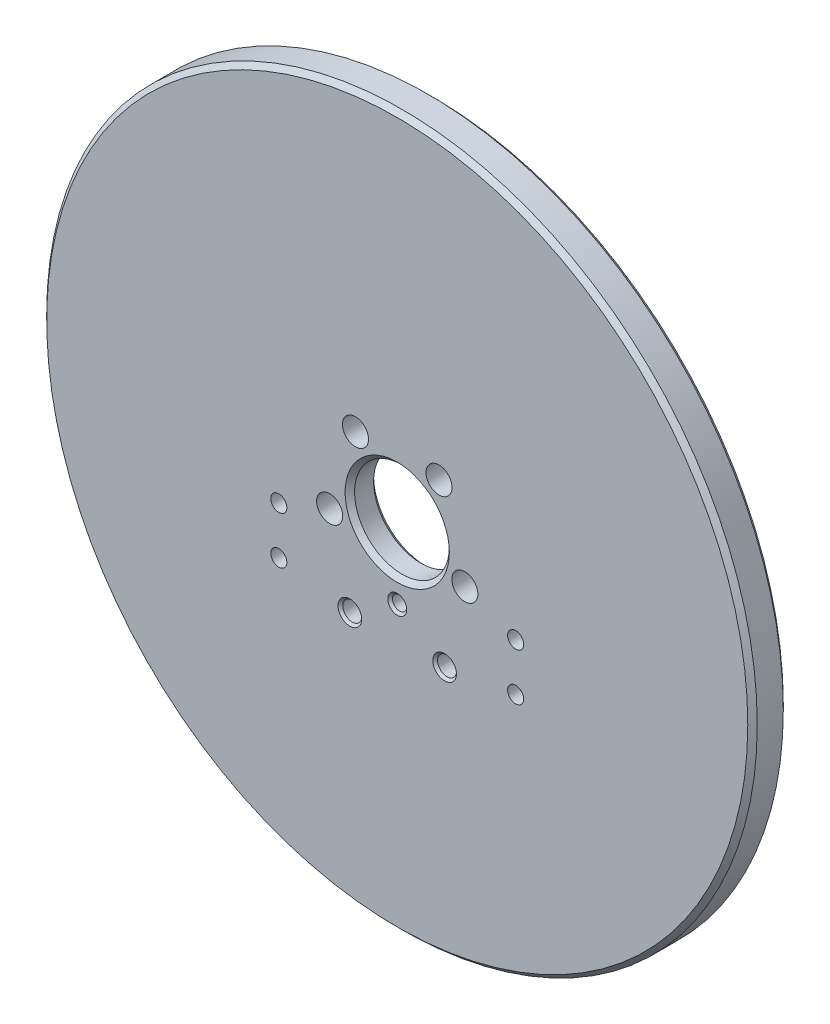
ISO-10303-21;
HEADER;
FILE_DESCRIPTION(('STEP AP214'),'2;1');
FILE_NAME('part.step','',(''),(''),'','','');
FILE_SCHEMA(('AUTOMOTIVE_DESIGN { 1 0 10303 214 1 1 1 1 }'));
ENDSEC;
DATA;
#1=APPLICATION_CONTEXT('core data for automotive mechanical design processes');
#2=APPLICATION_PROTOCOL_DEFINITION('international standard','automotive_design',2000,#1);
#3=PRODUCT_CONTEXT('',#1,'mechanical');
#4=PRODUCT('Part','Part','',(#3));
#5=PRODUCT_RELATED_PRODUCT_CATEGORY('part','',(#4));
#6=PRODUCT_DEFINITION_FORMATION('','',#4);
#7=PRODUCT_DEFINITION_CONTEXT('part definition',#1,'design');
#8=PRODUCT_DEFINITION('design','',#6,#7);
#9=PRODUCT_DEFINITION_SHAPE('','',#8);
#10=(LENGTH_UNIT() NAMED_UNIT(*) SI_UNIT(.MILLI.,.METRE.));
#11=(NAMED_UNIT(*) PLANE_ANGLE_UNIT() SI_UNIT($,.RADIAN.));
#12=(NAMED_UNIT(*) SI_UNIT($,.STERADIAN.) SOLID_ANGLE_UNIT());
#13=UNCERTAINTY_MEASURE_WITH_UNIT(LENGTH_MEASURE(1.E-05),#10,'distance_accuracy_value','');
#14=(GEOMETRIC_REPRESENTATION_CONTEXT(3) GLOBAL_UNCERTAINTY_ASSIGNED_CONTEXT((#13)) GLOBAL_UNIT_ASSIGNED_CONTEXT((#10,
#11,#12)) REPRESENTATION_CONTEXT('',''));
#15=CARTESIAN_POINT('',(0.,0.,0.));
#16=DIRECTION('',(0.,0.,1.));
#17=DIRECTION('',(1.,0.,0.));
#18=AXIS2_PLACEMENT_3D('',#15,#16,#17);
#19=CARTESIAN_POINT('',(18.5566127690193,-25.5225230893839,1.00000000000001));
#20=DIRECTION('',(0.,0.,1.));
#21=DIRECTION('',(1.,0.,0.));
#22=AXIS2_PLACEMENT_3D('',#19,#20,#21);
#23=PLANE('',#22);
#24=CARTESIAN_POINT('',(18.5566127690193,-25.5225230893839,1.00000000000001));
#25=DIRECTION('',(0.,0.,1.));
#26=DIRECTION('',(1.,0.,0.));
#27=AXIS2_PLACEMENT_3D('',#24,#25,#26);
#28=CIRCLE('',#27,41.);
#29=CARTESIAN_POINT('',(59.5566127690193,-25.5225230893839,1.00000000000001));
#30=VERTEX_POINT('',#29);
#31=EDGE_CURVE('E11',#30,#30,#28,.T.);
#32=ORIENTED_EDGE('',*,*,#31,.T.);
#33=EDGE_LOOP('',(#32));
#34=FACE_BOUND('',#33,.T.);
#35=CARTESIAN_POINT('',(18.5566127690193,-25.5225230893839,1.00000000000001));
#36=DIRECTION('',(0.,0.,1.));
#37=DIRECTION('',(1.,0.,0.));
#38=AXIS2_PLACEMENT_3D('',#35,#36,#37);
#39=CIRCLE('',#38,148.);
#40=CARTESIAN_POINT('',(166.556612769019,-25.5225230893839,1.00000000000001));
#41=VERTEX_POINT('',#40);
#42=EDGE_CURVE('E62',#41,#41,#39,.F.);
#43=ORIENTED_EDGE('',*,*,#42,.T.);
#44=EDGE_LOOP('',(#43));
#45=FACE_BOUND('',#44,.T.);
#46=CARTESIAN_POINT('',(-1.44338723098072,-68.5225230893839,1.00000000000001));
#47=DIRECTION('',(0.,0.,1.));
#48=DIRECTION('',(1.,0.,0.));
#49=AXIS2_PLACEMENT_3D('',#46,#47,#48);
#50=CIRCLE('',#49,4.00000000000001);
#51=CARTESIAN_POINT('',(2.55661276901929,-68.5225230893839,1.00000000000001));
#52=VERTEX_POINT('',#51);
#53=EDGE_CURVE('E149',#52,#52,#50,.T.);
#54=ORIENTED_EDGE('',*,*,#53,.T.);
#55=EDGE_LOOP('',(#54));
#56=FACE_BOUND('',#55,.T.);
#57=CARTESIAN_POINT('',(38.5566127690193,-68.5225230893839,1.00000000000001));
#58=DIRECTION('',(0.,0.,1.));
#59=DIRECTION('',(1.,0.,0.));
#60=AXIS2_PLACEMENT_3D('',#57,#58,#59);
#61=CIRCLE('',#60,4.00000000000003);
#62=CARTESIAN_POINT('',(42.5566127690193,-68.5225230893839,1.00000000000001));
#63=VERTEX_POINT('',#62);
#64=EDGE_CURVE('E152',#63,#63,#61,.T.);
#65=ORIENTED_EDGE('',*,*,#64,.T.);
#66=EDGE_LOOP('',(#65));
#67=FACE_BOUND('',#66,.T.);
#68=CARTESIAN_POINT('',(68.5566127690193,-63.5225230893839,1.00000000000001));
#69=DIRECTION('',(0.,0.,1.));
#70=DIRECTION('',(1.,0.,0.));
#71=AXIS2_PLACEMENT_3D('',#68,#69,#70);
#72=CIRCLE('',#71,3.4);
#73=CARTESIAN_POINT('',(71.9566127690193,-63.5225230893839,1.00000000000001));
#74=VERTEX_POINT('',#73);
#75=EDGE_CURVE('E155',#74,#74,#72,.T.);
#76=ORIENTED_EDGE('',*,*,#75,.T.);
#77=EDGE_LOOP('',(#76));
#78=FACE_BOUND('',#77,.T.);
#79=CARTESIAN_POINT('',(68.5566127690193,-43.5225230893839,1.00000000000001));
#80=DIRECTION('',(0.,0.,1.));
#81=DIRECTION('',(1.,0.,0.));
#82=AXIS2_PLACEMENT_3D('',#79,#80,#81);
#83=CIRCLE('',#82,3.4);
#84=CARTESIAN_POINT('',(71.9566127690193,-43.5225230893839,1.00000000000001));
#85=VERTEX_POINT('',#84);
#86=EDGE_CURVE('E161',#85,#85,#83,.T.);
#87=ORIENTED_EDGE('',*,*,#86,.T.);
#88=EDGE_LOOP('',(#87));
#89=FACE_BOUND('',#88,.T.);
#90=CARTESIAN_POINT('',(-31.4433872309807,-63.5225230893839,1.00000000000001));
#91=DIRECTION('',(0.,0.,1.));
#92=DIRECTION('',(1.,0.,0.));
#93=AXIS2_PLACEMENT_3D('',#90,#91,#92);
#94=CIRCLE('',#93,3.4);
#95=CARTESIAN_POINT('',(-28.0433872309807,-63.5225230893839,1.00000000000001));
#96=VERTEX_POINT('',#95);
#97=EDGE_CURVE('E167',#96,#96,#94,.T.);
#98=ORIENTED_EDGE('',*,*,#97,.T.);
#99=EDGE_LOOP('',(#98));
#100=FACE_BOUND('',#99,.T.);
#101=CARTESIAN_POINT('',(-31.4433872309807,-43.5225230893839,1.00000000000001));
#102=DIRECTION('',(0.,0.,1.));
#103=DIRECTION('',(1.,0.,0.));
#104=AXIS2_PLACEMENT_3D('',#101,#102,#103);
#105=CIRCLE('',#104,3.4);
#106=CARTESIAN_POINT('',(-28.0433872309807,-43.5225230893839,1.00000000000001));
#107=VERTEX_POINT('',#106);
#108=EDGE_CURVE('E173',#107,#107,#105,.T.);
#109=ORIENTED_EDGE('',*,*,#108,.T.);
#110=EDGE_LOOP('',(#109));
#111=FACE_BOUND('',#110,.T.);
#112=ADVANCED_FACE('F33',(#34,#45,#56,#67,#78,#89,#100,#111),#23,.F.);
#113=CARTESIAN_POINT('',(18.5566127690193,-25.5225230893839,4.00000000000001));
#114=DIRECTION('',(0.,0.,-1.));
#115=DIRECTION('',(-1.,0.,0.));
#116=AXIS2_PLACEMENT_3D('',#113,#114,#115);
#117=CYLINDRICAL_SURFACE('',#116,35.);
#118=CARTESIAN_POINT('',(18.5566127690193,-25.5225230893839,-3.49999999999996));
#119=DIRECTION('',(0.,0.,-1.));
#120=DIRECTION('',(-1.,0.,0.));
#121=AXIS2_PLACEMENT_3D('',#118,#119,#120);
#122=CIRCLE('',#121,35.);
#123=CARTESIAN_POINT('',(-16.4433872309807,-25.5225230893839,-3.49999999999996));
#124=VERTEX_POINT('',#123);
#125=EDGE_CURVE('E74',#124,#124,#122,.T.);
#126=ORIENTED_EDGE('',*,*,#125,.T.);
#127=EDGE_LOOP('',(#126));
#128=FACE_BOUND('',#127,.T.);
#129=CARTESIAN_POINT('',(18.5566127690193,-25.5225230893839,4.00000000000001));
#130=DIRECTION('',(0.,0.,-1.));
#131=DIRECTION('',(-1.,0.,0.));
#132=AXIS2_PLACEMENT_3D('',#129,#130,#131);
#133=CIRCLE('',#132,35.);
#134=CARTESIAN_POINT('',(-16.4433872309807,-25.5225230893839,4.00000000000001));
#135=VERTEX_POINT('',#134);
#136=EDGE_CURVE('E95',#135,#135,#133,.T.);
#137=ORIENTED_EDGE('',*,*,#136,.F.);
#138=EDGE_LOOP('',(#137));
#139=FACE_BOUND('',#138,.T.);
#140=ADVANCED_FACE('F201',(#128,#139),#117,.F.);
#141=CARTESIAN_POINT('',(18.5566127690193,-25.5225230893839,4.00000000000001));
#142=DIRECTION('',(0.,0.,-1.));
#143=DIRECTION('',(-1.,0.,0.));
#144=AXIS2_PLACEMENT_3D('',#141,#142,#143);
#145=PLANE('',#144);
#146=CARTESIAN_POINT('',(18.5566127690193,-25.5225230893839,4.00000000000001));
#147=DIRECTION('',(0.,0.,-1.));
#148=DIRECTION('',(-1.,0.,0.));
#149=AXIS2_PLACEMENT_3D('',#146,#147,#148);
#150=CIRCLE('',#149,22.0000000000001);
#151=CARTESIAN_POINT('',(-3.4433872309808,-25.5225230893839,4.00000000000001));
#152=VERTEX_POINT('',#151);
#153=EDGE_CURVE('E48',#152,#152,#150,.F.);
#154=ORIENTED_EDGE('',*,*,#153,.T.);
#155=EDGE_LOOP('',(#154));
#156=FACE_BOUND('',#155,.T.);
#157=CARTESIAN_POINT('',(18.5566127690193,-55.5225230893839,4.00000000000001));
#158=DIRECTION('',(0.,0.,-1.));
#159=DIRECTION('',(-1.,0.,0.));
#160=AXIS2_PLACEMENT_3D('',#157,#158,#159);
#161=CIRCLE('',#160,2.99999999999999);
#162=CARTESIAN_POINT('',(15.5566127690193,-55.5225230893839,4.00000000000001));
#163=VERTEX_POINT('',#162);
#164=EDGE_CURVE('E146',#163,#163,#161,.T.);
#165=ORIENTED_EDGE('',*,*,#164,.F.);
#166=EDGE_LOOP('',(#165));
#167=FACE_BOUND('',#166,.T.);
#168=CARTESIAN_POINT('',(0.923055200245035,-1.25201325813547,4.00000000000001));
#169=DIRECTION('',(0.,0.,-1.));
#170=DIRECTION('',(-1.,0.,0.));
#171=AXIS2_PLACEMENT_3D('',#168,#169,#170);
#172=CIRCLE('',#171,3.3);
#173=CARTESIAN_POINT('',(-2.37694479975496,-1.25201325813547,4.00000000000001));
#174=VERTEX_POINT('',#173);
#175=EDGE_CURVE('E96',#174,#174,#172,.T.);
#176=ORIENTED_EDGE('',*,*,#175,.F.);
#177=EDGE_LOOP('',(#176));
#178=FACE_BOUND('',#177,.T.);
#179=CARTESIAN_POINT('',(36.1901703377934,-1.2520132581354,4.00000000000001));
#180=DIRECTION('',(0.,0.,-1.));
#181=DIRECTION('',(-1.,0.,0.));
#182=AXIS2_PLACEMENT_3D('',#179,#180,#181);
#183=CIRCLE('',#182,3.3);
#184=CARTESIAN_POINT('',(32.8901703377934,-1.2520132581354,4.00000000000001));
#185=VERTEX_POINT('',#184);
#186=EDGE_CURVE('E101',#185,#185,#183,.T.);
#187=ORIENTED_EDGE('',*,*,#186,.F.);
#188=EDGE_LOOP('',(#187));
#189=FACE_BOUND('',#188,.T.);
#190=CARTESIAN_POINT('',(47.0883082578739,-34.7930329206322,4.00000000000001));
#191=DIRECTION('',(0.,0.,-1.));
#192=DIRECTION('',(-1.,0.,0.));
#193=AXIS2_PLACEMENT_3D('',#190,#191,#192);
#194=CIRCLE('',#193,3.29999999999999);
#195=CARTESIAN_POINT('',(43.7883082578739,-34.7930329206322,4.00000000000001));
#196=VERTEX_POINT('',#195);
#197=EDGE_CURVE('E106',#196,#196,#194,.T.);
#198=ORIENTED_EDGE('',*,*,#197,.F.);
#199=EDGE_LOOP('',(#198));
#200=FACE_BOUND('',#199,.T.);
#201=CARTESIAN_POINT('',(-9.97508271983532,-34.7930329206323,4.00000000000001));
#202=DIRECTION('',(0.,0.,-1.));
#203=DIRECTION('',(-1.,0.,0.));
#204=AXIS2_PLACEMENT_3D('',#201,#202,#203);
#205=CIRCLE('',#204,3.3);
#206=CARTESIAN_POINT('',(-13.2750827198353,-34.7930329206323,4.00000000000001));
#207=VERTEX_POINT('',#206);
#208=EDGE_CURVE('E111',#207,#207,#205,.T.);
#209=ORIENTED_EDGE('',*,*,#208,.F.);
#210=EDGE_LOOP('',(#209));
#211=FACE_BOUND('',#210,.T.);
#212=ORIENTED_EDGE('',*,*,#136,.T.);
#213=EDGE_LOOP('',(#212));
#214=FACE_BOUND('',#213,.T.);
#215=ADVANCED_FACE('F206',(#156,#167,#178,#189,#200,#211,#214),#145,.T.);
#216=CARTESIAN_POINT('',(18.5566127690193,-25.5225230893839,16.));
#217=DIRECTION('',(0.,0.,1.));
#218=DIRECTION('',(1.,0.,0.));
#219=AXIS2_PLACEMENT_3D('',#216,#217,#218);
#220=PLANE('',#219);
#221=CARTESIAN_POINT('',(18.5566127690193,-25.5225230893839,16.));
#222=DIRECTION('',(0.,0.,1.));
#223=DIRECTION('',(1.,0.,0.));
#224=AXIS2_PLACEMENT_3D('',#221,#222,#223);
#225=CIRCLE('',#224,22.);
#226=CARTESIAN_POINT('',(40.5566127690193,-25.5225230893839,16.));
#227=VERTEX_POINT('',#226);
#228=EDGE_CURVE('E44',#227,#227,#225,.F.);
#229=ORIENTED_EDGE('',*,*,#228,.T.);
#230=EDGE_LOOP('',(#229));
#231=FACE_BOUND('',#230,.T.);
#232=CARTESIAN_POINT('',(18.5566127690193,-25.5225230893839,16.));
#233=DIRECTION('',(0.,0.,1.));
#234=DIRECTION('',(1.,0.,0.));
#235=AXIS2_PLACEMENT_3D('',#232,#233,#234);
#236=CIRCLE('',#235,148.);
#237=CARTESIAN_POINT('',(166.556612769019,-25.5225230893839,16.));
#238=VERTEX_POINT('',#237);
#239=EDGE_CURVE('E59',#238,#238,#236,.T.);
#240=ORIENTED_EDGE('',*,*,#239,.T.);
#241=EDGE_LOOP('',(#240));
#242=FACE_BOUND('',#241,.T.);
#243=CARTESIAN_POINT('',(-31.4433872309807,-43.5225230893839,16.));
#244=DIRECTION('',(0.,0.,1.));
#245=DIRECTION('',(1.,0.,0.));
#246=AXIS2_PLACEMENT_3D('',#243,#244,#245);
#247=CIRCLE('',#246,3.39999999999999);
#248=CARTESIAN_POINT('',(-28.0433872309807,-43.5225230893839,16.));
#249=VERTEX_POINT('',#248);
#250=EDGE_CURVE('E176',#249,#249,#247,.T.);
#251=ORIENTED_EDGE('',*,*,#250,.F.);
#252=EDGE_LOOP('',(#251));
#253=FACE_BOUND('',#252,.T.);
#254=CARTESIAN_POINT('',(-31.4433872309807,-63.5225230893839,16.));
#255=DIRECTION('',(0.,0.,1.));
#256=DIRECTION('',(1.,0.,0.));
#257=AXIS2_PLACEMENT_3D('',#254,#255,#256);
#258=CIRCLE('',#257,3.39999999999999);
#259=CARTESIAN_POINT('',(-28.0433872309807,-63.5225230893839,16.));
#260=VERTEX_POINT('',#259);
#261=EDGE_CURVE('E170',#260,#260,#258,.T.);
#262=ORIENTED_EDGE('',*,*,#261,.F.);
#263=EDGE_LOOP('',(#262));
#264=FACE_BOUND('',#263,.T.);
#265=CARTESIAN_POINT('',(68.5566127690193,-43.5225230893839,16.));
#266=DIRECTION('',(0.,0.,1.));
#267=DIRECTION('',(1.,0.,0.));
#268=AXIS2_PLACEMENT_3D('',#265,#266,#267);
#269=CIRCLE('',#268,3.39999999999999);
#270=CARTESIAN_POINT('',(71.9566127690193,-43.5225230893839,16.));
#271=VERTEX_POINT('',#270);
#272=EDGE_CURVE('E164',#271,#271,#269,.T.);
#273=ORIENTED_EDGE('',*,*,#272,.F.);
#274=EDGE_LOOP('',(#273));
#275=FACE_BOUND('',#274,.T.);
#276=CARTESIAN_POINT('',(68.5566127690193,-63.5225230893839,16.));
#277=DIRECTION('',(0.,0.,1.));
#278=DIRECTION('',(1.,0.,0.));
#279=AXIS2_PLACEMENT_3D('',#276,#277,#278);
#280=CIRCLE('',#279,3.39999999999999);
#281=CARTESIAN_POINT('',(71.9566127690193,-63.5225230893839,16.));
#282=VERTEX_POINT('',#281);
#283=EDGE_CURVE('E158',#282,#282,#280,.T.);
#284=ORIENTED_EDGE('',*,*,#283,.F.);
#285=EDGE_LOOP('',(#284));
#286=FACE_BOUND('',#285,.T.);
#287=CARTESIAN_POINT('',(38.5566127690193,-68.5225230893839,16.));
#288=DIRECTION('',(0.,0.,1.));
#289=DIRECTION('',(1.,0.,0.));
#290=AXIS2_PLACEMENT_3D('',#287,#288,#289);
#291=CIRCLE('',#290,5.00000000000012);
#292=CARTESIAN_POINT('',(43.5566127690194,-68.5225230893839,16.));
#293=VERTEX_POINT('',#292);
#294=EDGE_CURVE('E80',#293,#293,#291,.F.);
#295=ORIENTED_EDGE('',*,*,#294,.T.);
#296=EDGE_LOOP('',(#295));
#297=FACE_BOUND('',#296,.T.);
#298=CARTESIAN_POINT('',(-1.44338723098072,-68.5225230893839,16.));
#299=DIRECTION('',(0.,0.,1.));
#300=DIRECTION('',(1.,0.,0.));
#301=AXIS2_PLACEMENT_3D('',#298,#299,#300);
#302=CIRCLE('',#301,5.00000000000011);
#303=CARTESIAN_POINT('',(3.5566127690194,-68.5225230893839,16.));
#304=VERTEX_POINT('',#303);
#305=EDGE_CURVE('E83',#304,#304,#302,.F.);
#306=ORIENTED_EDGE('',*,*,#305,.T.);
#307=EDGE_LOOP('',(#306));
#308=FACE_BOUND('',#307,.T.);
#309=CARTESIAN_POINT('',(18.5566127690193,-55.5225230893839,16.));
#310=DIRECTION('',(0.,0.,1.));
#311=DIRECTION('',(1.,0.,0.));
#312=AXIS2_PLACEMENT_3D('',#309,#310,#311);
#313=CIRCLE('',#312,3.99999999999984);
#314=CARTESIAN_POINT('',(22.5566127690191,-55.5225230893839,16.));
#315=VERTEX_POINT('',#314);
#316=EDGE_CURVE('E89',#315,#315,#313,.F.);
#317=ORIENTED_EDGE('',*,*,#316,.T.);
#318=EDGE_LOOP('',(#317));
#319=FACE_BOUND('',#318,.T.);
#320=CARTESIAN_POINT('',(0.923055200245035,-1.25201325813547,16.));
#321=DIRECTION('',(0.,0.,1.));
#322=DIRECTION('',(1.,0.,0.));
#323=AXIS2_PLACEMENT_3D('',#320,#321,#322);
#324=CIRCLE('',#323,5.5);
#325=CARTESIAN_POINT('',(6.42305520024503,-1.25201325813547,16.));
#326=VERTEX_POINT('',#325);
#327=EDGE_CURVE('E143',#326,#326,#324,.T.);
#328=ORIENTED_EDGE('',*,*,#327,.F.);
#329=EDGE_LOOP('',(#328));
#330=FACE_BOUND('',#329,.T.);
#331=CARTESIAN_POINT('',(36.1901703377934,-1.2520132581354,16.));
#332=DIRECTION('',(0.,0.,1.));
#333=DIRECTION('',(1.,0.,0.));
#334=AXIS2_PLACEMENT_3D('',#331,#332,#333);
#335=CIRCLE('',#334,5.5);
#336=CARTESIAN_POINT('',(41.6901703377934,-1.2520132581354,16.));
#337=VERTEX_POINT('',#336);
#338=EDGE_CURVE('E99',#337,#337,#335,.T.);
#339=ORIENTED_EDGE('',*,*,#338,.F.);
#340=EDGE_LOOP('',(#339));
#341=FACE_BOUND('',#340,.T.);
#342=CARTESIAN_POINT('',(47.0883082578739,-34.7930329206322,16.));
#343=DIRECTION('',(0.,0.,1.));
#344=DIRECTION('',(1.,0.,0.));
#345=AXIS2_PLACEMENT_3D('',#342,#343,#344);
#346=CIRCLE('',#345,5.5);
#347=CARTESIAN_POINT('',(52.5883082578739,-34.7930329206322,16.));
#348=VERTEX_POINT('',#347);
#349=EDGE_CURVE('E104',#348,#348,#346,.T.);
#350=ORIENTED_EDGE('',*,*,#349,.F.);
#351=EDGE_LOOP('',(#350));
#352=FACE_BOUND('',#351,.T.);
#353=CARTESIAN_POINT('',(-9.97508271983532,-34.7930329206323,16.));
#354=DIRECTION('',(0.,0.,1.));
#355=DIRECTION('',(1.,0.,0.));
#356=AXIS2_PLACEMENT_3D('',#353,#354,#355);
#357=CIRCLE('',#356,5.5);
#358=CARTESIAN_POINT('',(-4.47508271983532,-34.7930329206323,16.));
#359=VERTEX_POINT('',#358);
#360=EDGE_CURVE('E109',#359,#359,#357,.T.);
#361=ORIENTED_EDGE('',*,*,#360,.F.);
#362=EDGE_LOOP('',(#361));
#363=FACE_BOUND('',#362,.T.);
#364=ADVANCED_FACE('F212',(#231,#242,#253,#264,#275,#286,#297,#308,#319,#330,#341,#352,#363),
#220,.T.);
#365=CARTESIAN_POINT('',(18.5566127690193,-25.5225230893839,16.));
#366=DIRECTION('',(0.,0.,-1.));
#367=DIRECTION('',(-1.,0.,0.));
#368=AXIS2_PLACEMENT_3D('',#365,#366,#367);
#369=CYLINDRICAL_SURFACE('',#368,150.);
#370=CARTESIAN_POINT('',(18.5566127690193,-25.5225230893839,3.0000000000001));
#371=DIRECTION('',(0.,0.,1.));
#372=DIRECTION('',(1.,0.,0.));
#373=AXIS2_PLACEMENT_3D('',#370,#371,#372);
#374=CIRCLE('',#373,150.);
#375=CARTESIAN_POINT('',(168.556612769019,-25.5225230893839,3.0000000000001));
#376=VERTEX_POINT('',#375);
#377=EDGE_CURVE('E65',#376,#376,#374,.T.);
#378=ORIENTED_EDGE('',*,*,#377,.T.);
#379=EDGE_LOOP('',(#378));
#380=FACE_BOUND('',#379,.T.);
#381=CARTESIAN_POINT('',(18.5566127690193,-25.5225230893839,14.));
#382=DIRECTION('',(0.,0.,1.));
#383=DIRECTION('',(1.,0.,0.));
#384=AXIS2_PLACEMENT_3D('',#381,#382,#383);
#385=CIRCLE('',#384,150.);
#386=CARTESIAN_POINT('',(168.556612769019,-25.5225230893839,14.));
#387=VERTEX_POINT('',#386);
#388=EDGE_CURVE('E68',#387,#387,#385,.F.);
#389=ORIENTED_EDGE('',*,*,#388,.T.);
#390=EDGE_LOOP('',(#389));
#391=FACE_BOUND('',#390,.T.);
#392=ADVANCED_FACE('F213',(#380,#391),#369,.T.);
#393=CARTESIAN_POINT('',(-9.97508271983532,-34.7930329206323,16.));
#394=DIRECTION('',(0.,0.,1.));
#395=DIRECTION('',(1.,0.,0.));
#396=AXIS2_PLACEMENT_3D('',#393,#394,#395);
#397=CYLINDRICAL_SURFACE('',#396,3.3);
#398=ORIENTED_EDGE('',*,*,#208,.T.);
#399=EDGE_LOOP('',(#398));
#400=FACE_BOUND('',#399,.T.);
#401=CARTESIAN_POINT('',(-9.97508271983532,-34.7930329206323,8.00000000000001));
#402=DIRECTION('',(0.,0.,1.));
#403=DIRECTION('',(1.,0.,0.));
#404=AXIS2_PLACEMENT_3D('',#401,#402,#403);
#405=CIRCLE('',#404,3.3);
#406=CARTESIAN_POINT('',(-6.67508271983532,-34.7930329206323,8.00000000000001));
#407=VERTEX_POINT('',#406);
#408=EDGE_CURVE('E114',#407,#407,#405,.T.);
#409=ORIENTED_EDGE('',*,*,#408,.T.);
#410=EDGE_LOOP('',(#409));
#411=FACE_BOUND('',#410,.T.);
#412=ADVANCED_FACE('F216',(#400,#411),#397,.F.);
#413=CARTESIAN_POINT('',(-6.67508271983532,-34.7930329206323,8.00000000000001));
#414=DIRECTION('',(0.,0.,-1.));
#415=DIRECTION('',(-1.,0.,0.));
#416=AXIS2_PLACEMENT_3D('',#413,#414,#415);
#417=PLANE('',#416);
#418=ORIENTED_EDGE('',*,*,#408,.F.);
#419=EDGE_LOOP('',(#418));
#420=FACE_BOUND('',#419,.T.);
#421=CARTESIAN_POINT('',(-9.97508271983532,-34.7930329206323,8.00000000000001));
#422=DIRECTION('',(0.,0.,1.));
#423=DIRECTION('',(1.,0.,0.));
#424=AXIS2_PLACEMENT_3D('',#421,#422,#423);
#425=CIRCLE('',#424,5.5);
#426=CARTESIAN_POINT('',(-4.47508271983532,-34.7930329206323,8.00000000000001));
#427=VERTEX_POINT('',#426);
#428=EDGE_CURVE('E119',#427,#427,#425,.T.);
#429=ORIENTED_EDGE('',*,*,#428,.T.);
#430=EDGE_LOOP('',(#429));
#431=FACE_BOUND('',#430,.T.);
#432=ADVANCED_FACE('F339',(#420,#431),#417,.F.);
#433=CARTESIAN_POINT('',(-9.97508271983532,-34.7930329206323,16.));
#434=DIRECTION('',(0.,0.,1.));
#435=DIRECTION('',(1.,0.,0.));
#436=AXIS2_PLACEMENT_3D('',#433,#434,#435);
#437=CYLINDRICAL_SURFACE('',#436,5.5);
#438=ORIENTED_EDGE('',*,*,#428,.F.);
#439=EDGE_LOOP('',(#438));
#440=FACE_BOUND('',#439,.T.);
#441=ORIENTED_EDGE('',*,*,#360,.T.);
#442=EDGE_LOOP('',(#441));
#443=FACE_BOUND('',#442,.T.);
#444=ADVANCED_FACE('F346',(#440,#443),#437,.F.);
#445=CARTESIAN_POINT('',(47.0883082578739,-34.7930329206322,16.));
#446=DIRECTION('',(0.,0.,1.));
#447=DIRECTION('',(1.,0.,0.));
#448=AXIS2_PLACEMENT_3D('',#445,#446,#447);
#449=CYLINDRICAL_SURFACE('',#448,3.29999999999999);
#450=ORIENTED_EDGE('',*,*,#197,.T.);
#451=EDGE_LOOP('',(#450));
#452=FACE_BOUND('',#451,.T.);
#453=CARTESIAN_POINT('',(47.0883082578739,-34.7930329206322,8.00000000000001));
#454=DIRECTION('',(0.,0.,1.));
#455=DIRECTION('',(1.,0.,0.));
#456=AXIS2_PLACEMENT_3D('',#453,#454,#455);
#457=CIRCLE('',#456,3.3);
#458=CARTESIAN_POINT('',(50.3883082578739,-34.7930329206322,8.00000000000001));
#459=VERTEX_POINT('',#458);
#460=EDGE_CURVE('E110',#459,#459,#457,.T.);
#461=ORIENTED_EDGE('',*,*,#460,.T.);
#462=EDGE_LOOP('',(#461));
#463=FACE_BOUND('',#462,.T.);
#464=ADVANCED_FACE('F354',(#452,#463),#449,.F.);
#465=CARTESIAN_POINT('',(50.3883082578739,-34.7930329206322,8.00000000000001));
#466=DIRECTION('',(0.,0.,-1.));
#467=DIRECTION('',(-1.,0.,0.));
#468=AXIS2_PLACEMENT_3D('',#465,#466,#467);
#469=PLANE('',#468);
#470=ORIENTED_EDGE('',*,*,#460,.F.);
#471=EDGE_LOOP('',(#470));
#472=FACE_BOUND('',#471,.T.);
#473=CARTESIAN_POINT('',(47.0883082578739,-34.7930329206322,8.00000000000001));
#474=DIRECTION('',(0.,0.,1.));
#475=DIRECTION('',(1.,0.,0.));
#476=AXIS2_PLACEMENT_3D('',#473,#474,#475);
#477=CIRCLE('',#476,5.5);
#478=CARTESIAN_POINT('',(52.5883082578739,-34.7930329206322,8.00000000000001));
#479=VERTEX_POINT('',#478);
#480=EDGE_CURVE('E126',#479,#479,#477,.T.);
#481=ORIENTED_EDGE('',*,*,#480,.T.);
#482=EDGE_LOOP('',(#481));
#483=FACE_BOUND('',#482,.T.);
#484=ADVANCED_FACE('F362',(#472,#483),#469,.F.);
#485=CARTESIAN_POINT('',(47.0883082578739,-34.7930329206322,16.));
#486=DIRECTION('',(0.,0.,1.));
#487=DIRECTION('',(1.,0.,0.));
#488=AXIS2_PLACEMENT_3D('',#485,#486,#487);
#489=CYLINDRICAL_SURFACE('',#488,5.5);
#490=ORIENTED_EDGE('',*,*,#480,.F.);
#491=EDGE_LOOP('',(#490));
#492=FACE_BOUND('',#491,.T.);
#493=ORIENTED_EDGE('',*,*,#349,.T.);
#494=EDGE_LOOP('',(#493));
#495=FACE_BOUND('',#494,.T.);
#496=ADVANCED_FACE('F370',(#492,#495),#489,.F.);
#497=CARTESIAN_POINT('',(36.1901703377934,-1.2520132581354,16.));
#498=DIRECTION('',(0.,0.,1.));
#499=DIRECTION('',(1.,0.,0.));
#500=AXIS2_PLACEMENT_3D('',#497,#498,#499);
#501=CYLINDRICAL_SURFACE('',#500,3.3);
#502=ORIENTED_EDGE('',*,*,#186,.T.);
#503=EDGE_LOOP('',(#502));
#504=FACE_BOUND('',#503,.T.);
#505=CARTESIAN_POINT('',(36.1901703377934,-1.2520132581354,8.00000000000001));
#506=DIRECTION('',(0.,0.,1.));
#507=DIRECTION('',(1.,0.,0.));
#508=AXIS2_PLACEMENT_3D('',#505,#506,#507);
#509=CIRCLE('',#508,3.3);
#510=CARTESIAN_POINT('',(39.4901703377934,-1.2520132581354,8.00000000000001));
#511=VERTEX_POINT('',#510);
#512=EDGE_CURVE('E105',#511,#511,#509,.T.);
#513=ORIENTED_EDGE('',*,*,#512,.T.);
#514=EDGE_LOOP('',(#513));
#515=FACE_BOUND('',#514,.T.);
#516=ADVANCED_FACE('F378',(#504,#515),#501,.F.);
#517=CARTESIAN_POINT('',(39.4901703377934,-1.2520132581354,8.00000000000001));
#518=DIRECTION('',(0.,0.,-1.));
#519=DIRECTION('',(-1.,0.,0.));
#520=AXIS2_PLACEMENT_3D('',#517,#518,#519);
#521=PLANE('',#520);
#522=ORIENTED_EDGE('',*,*,#512,.F.);
#523=EDGE_LOOP('',(#522));
#524=FACE_BOUND('',#523,.T.);
#525=CARTESIAN_POINT('',(36.1901703377934,-1.2520132581354,8.00000000000001));
#526=DIRECTION('',(0.,0.,1.));
#527=DIRECTION('',(1.,0.,0.));
#528=AXIS2_PLACEMENT_3D('',#525,#526,#527);
#529=CIRCLE('',#528,5.5);
#530=CARTESIAN_POINT('',(41.6901703377934,-1.2520132581354,8.00000000000001));
#531=VERTEX_POINT('',#530);
#532=EDGE_CURVE('E133',#531,#531,#529,.T.);
#533=ORIENTED_EDGE('',*,*,#532,.T.);
#534=EDGE_LOOP('',(#533));
#535=FACE_BOUND('',#534,.T.);
#536=ADVANCED_FACE('F386',(#524,#535),#521,.F.);
#537=CARTESIAN_POINT('',(36.1901703377934,-1.2520132581354,16.));
#538=DIRECTION('',(0.,0.,1.));
#539=DIRECTION('',(1.,0.,0.));
#540=AXIS2_PLACEMENT_3D('',#537,#538,#539);
#541=CYLINDRICAL_SURFACE('',#540,5.5);
#542=ORIENTED_EDGE('',*,*,#532,.F.);
#543=EDGE_LOOP('',(#542));
#544=FACE_BOUND('',#543,.T.);
#545=ORIENTED_EDGE('',*,*,#338,.T.);
#546=EDGE_LOOP('',(#545));
#547=FACE_BOUND('',#546,.T.);
#548=ADVANCED_FACE('F394',(#544,#547),#541,.F.);
#549=CARTESIAN_POINT('',(0.923055200245035,-1.25201325813547,16.));
#550=DIRECTION('',(0.,0.,1.));
#551=DIRECTION('',(1.,0.,0.));
#552=AXIS2_PLACEMENT_3D('',#549,#550,#551);
#553=CYLINDRICAL_SURFACE('',#552,3.3);
#554=ORIENTED_EDGE('',*,*,#175,.T.);
#555=EDGE_LOOP('',(#554));
#556=FACE_BOUND('',#555,.T.);
#557=CARTESIAN_POINT('',(0.923055200245035,-1.25201325813547,8.00000000000001));
#558=DIRECTION('',(0.,0.,1.));
#559=DIRECTION('',(1.,0.,0.));
#560=AXIS2_PLACEMENT_3D('',#557,#558,#559);
#561=CIRCLE('',#560,3.3);
#562=CARTESIAN_POINT('',(4.22305520024504,-1.25201325813547,8.00000000000001));
#563=VERTEX_POINT('',#562);
#564=EDGE_CURVE('E100',#563,#563,#561,.T.);
#565=ORIENTED_EDGE('',*,*,#564,.T.);
#566=EDGE_LOOP('',(#565));
#567=FACE_BOUND('',#566,.T.);
#568=ADVANCED_FACE('F402',(#556,#567),#553,.F.);
#569=CARTESIAN_POINT('',(4.22305520024504,-1.25201325813547,8.00000000000001));
#570=DIRECTION('',(0.,0.,-1.));
#571=DIRECTION('',(-1.,0.,0.));
#572=AXIS2_PLACEMENT_3D('',#569,#570,#571);
#573=PLANE('',#572);
#574=ORIENTED_EDGE('',*,*,#564,.F.);
#575=EDGE_LOOP('',(#574));
#576=FACE_BOUND('',#575,.T.);
#577=CARTESIAN_POINT('',(0.923055200245035,-1.25201325813547,8.00000000000001));
#578=DIRECTION('',(0.,0.,1.));
#579=DIRECTION('',(1.,0.,0.));
#580=AXIS2_PLACEMENT_3D('',#577,#578,#579);
#581=CIRCLE('',#580,5.5);
#582=CARTESIAN_POINT('',(6.42305520024503,-1.25201325813547,8.00000000000001));
#583=VERTEX_POINT('',#582);
#584=EDGE_CURVE('E140',#583,#583,#581,.T.);
#585=ORIENTED_EDGE('',*,*,#584,.T.);
#586=EDGE_LOOP('',(#585));
#587=FACE_BOUND('',#586,.T.);
#588=ADVANCED_FACE('F410',(#576,#587),#573,.F.);
#589=CARTESIAN_POINT('',(0.923055200245035,-1.25201325813547,16.));
#590=DIRECTION('',(0.,0.,1.));
#591=DIRECTION('',(1.,0.,0.));
#592=AXIS2_PLACEMENT_3D('',#589,#590,#591);
#593=CYLINDRICAL_SURFACE('',#592,5.5);
#594=ORIENTED_EDGE('',*,*,#584,.F.);
#595=EDGE_LOOP('',(#594));
#596=FACE_BOUND('',#595,.T.);
#597=ORIENTED_EDGE('',*,*,#327,.T.);
#598=EDGE_LOOP('',(#597));
#599=FACE_BOUND('',#598,.T.);
#600=ADVANCED_FACE('F418',(#596,#599),#593,.F.);
#601=CARTESIAN_POINT('',(18.5566127690193,-55.5225230893839,16.));
#602=DIRECTION('',(0.,0.,1.));
#603=DIRECTION('',(1.,0.,0.));
#604=AXIS2_PLACEMENT_3D('',#601,#602,#603);
#605=CYLINDRICAL_SURFACE('',#604,2.99999999999999);
#606=CARTESIAN_POINT('',(18.5566127690193,-55.5225230893839,15.0000000000002));
#607=DIRECTION('',(0.,0.,1.));
#608=DIRECTION('',(1.,0.,0.));
#609=AXIS2_PLACEMENT_3D('',#606,#607,#608);
#610=CIRCLE('',#609,2.99999999999999);
#611=CARTESIAN_POINT('',(21.5566127690193,-55.5225230893839,15.0000000000002));
#612=VERTEX_POINT('',#611);
#613=EDGE_CURVE('E92',#612,#612,#610,.T.);
#614=ORIENTED_EDGE('',*,*,#613,.T.);
#615=EDGE_LOOP('',(#614));
#616=FACE_BOUND('',#615,.T.);
#617=ORIENTED_EDGE('',*,*,#164,.T.);
#618=EDGE_LOOP('',(#617));
#619=FACE_BOUND('',#618,.T.);
#620=ADVANCED_FACE('F222',(#616,#619),#605,.F.);
#621=CARTESIAN_POINT('',(18.5566127690193,-55.5225230893839,15.0000000000002));
#622=DIRECTION('',(0.,0.,1.));
#623=DIRECTION('',(1.,0.,0.));
#624=AXIS2_PLACEMENT_3D('',#621,#622,#623);
#625=CONICAL_SURFACE('',#624,2.99999999999999,0.785398163397443);
#626=ORIENTED_EDGE('',*,*,#316,.F.);
#627=EDGE_LOOP('',(#626));
#628=FACE_BOUND('',#627,.T.);
#629=ORIENTED_EDGE('',*,*,#613,.F.);
#630=EDGE_LOOP('',(#629));
#631=FACE_BOUND('',#630,.T.);
#632=ADVANCED_FACE('F218',(#628,#631),#625,.F.);
#633=CARTESIAN_POINT('',(-1.44338723098072,-68.5225230893839,1.00000000000001));
#634=DIRECTION('',(0.,0.,1.));
#635=DIRECTION('',(1.,0.,0.));
#636=AXIS2_PLACEMENT_3D('',#633,#634,#635);
#637=CYLINDRICAL_SURFACE('',#636,4.00000000000001);
#638=CARTESIAN_POINT('',(-1.44338723098072,-68.5225230893839,14.9999999999999));
#639=DIRECTION('',(0.,0.,1.));
#640=DIRECTION('',(1.,0.,0.));
#641=AXIS2_PLACEMENT_3D('',#638,#639,#640);
#642=CIRCLE('',#641,4.00000000000001);
#643=CARTESIAN_POINT('',(2.55661276901929,-68.5225230893839,14.9999999999999));
#644=VERTEX_POINT('',#643);
#645=EDGE_CURVE('E77',#644,#644,#642,.T.);
#646=CARTESIAN_POINT('',(2.55661276901929,-68.5225230893839,14.9999999999999));
#647=CARTESIAN_POINT('',(2.55661276901929,-68.5225230893839,14.8541666666666));
#648=CARTESIAN_POINT('',(2.55661276901929,-68.5225230893839,14.7083333333332));
#649=CARTESIAN_POINT('',(2.55661276901929,-68.5225230893839,14.4166666666666));
#650=CARTESIAN_POINT('',(2.55661276901929,-68.5225230893839,14.2708333333332));
#651=CARTESIAN_POINT('',(2.55661276901929,-68.5225230893839,13.9791666666666));
#652=CARTESIAN_POINT('',(2.55661276901929,-68.5225230893839,13.8333333333332));
#653=CARTESIAN_POINT('',(2.55661276901929,-68.5225230893839,13.5416666666666));
#654=CARTESIAN_POINT('',(2.55661276901929,-68.5225230893839,13.3958333333332));
#655=CARTESIAN_POINT('',(2.55661276901929,-68.5225230893839,13.1041666666666));
#656=CARTESIAN_POINT('',(2.55661276901929,-68.5225230893839,12.9583333333332));
#657=CARTESIAN_POINT('',(2.55661276901929,-68.5225230893839,12.6666666666666));
#658=CARTESIAN_POINT('',(2.55661276901929,-68.5225230893839,12.5208333333332));
#659=CARTESIAN_POINT('',(2.55661276901929,-68.5225230893839,12.2291666666666));
#660=CARTESIAN_POINT('',(2.55661276901929,-68.5225230893839,12.0833333333333));
#661=CARTESIAN_POINT('',(2.55661276901929,-68.5225230893839,11.7916666666666));
#662=CARTESIAN_POINT('',(2.55661276901929,-68.5225230893839,11.6458333333333));
#663=CARTESIAN_POINT('',(2.55661276901929,-68.5225230893839,11.3541666666666));
#664=CARTESIAN_POINT('',(2.55661276901929,-68.5225230893839,11.2083333333333));
#665=CARTESIAN_POINT('',(2.55661276901929,-68.5225230893839,10.9166666666666));
#666=CARTESIAN_POINT('',(2.55661276901929,-68.5225230893839,10.7708333333333));
#667=CARTESIAN_POINT('',(2.55661276901929,-68.5225230893839,10.4791666666666));
#668=CARTESIAN_POINT('',(2.55661276901929,-68.5225230893839,10.3333333333333));
#669=CARTESIAN_POINT('',(2.55661276901929,-68.5225230893839,10.0416666666666));
#670=CARTESIAN_POINT('',(2.55661276901929,-68.5225230893839,9.89583333333327));
#671=CARTESIAN_POINT('',(2.55661276901929,-68.5225230893839,9.6041666666666));
#672=CARTESIAN_POINT('',(2.55661276901929,-68.5225230893839,9.45833333333327));
#673=CARTESIAN_POINT('',(2.55661276901929,-68.5225230893839,9.16666666666661));
#674=CARTESIAN_POINT('',(2.55661276901929,-68.5225230893839,9.02083333333328));
#675=CARTESIAN_POINT('',(2.55661276901929,-68.5225230893839,8.72916666666661));
#676=CARTESIAN_POINT('',(2.55661276901929,-68.5225230893839,8.58333333333328));
#677=CARTESIAN_POINT('',(2.55661276901929,-68.5225230893839,8.29166666666662));
#678=CARTESIAN_POINT('',(2.55661276901929,-68.5225230893839,8.14583333333328));
#679=CARTESIAN_POINT('',(2.55661276901929,-68.5225230893839,7.85416666666662));
#680=CARTESIAN_POINT('',(2.55661276901929,-68.5225230893839,7.70833333333329));
#681=CARTESIAN_POINT('',(2.55661276901929,-68.5225230893839,7.41666666666662));
#682=CARTESIAN_POINT('',(2.55661276901929,-68.5225230893839,7.27083333333329));
#683=CARTESIAN_POINT('',(2.55661276901929,-68.5225230893839,6.97916666666663));
#684=CARTESIAN_POINT('',(2.55661276901929,-68.5225230893839,6.8333333333333));
#685=CARTESIAN_POINT('',(2.55661276901929,-68.5225230893839,6.54166666666663));
#686=CARTESIAN_POINT('',(2.55661276901929,-68.5225230893839,6.3958333333333));
#687=CARTESIAN_POINT('',(2.55661276901929,-68.5225230893839,6.10416666666664));
#688=CARTESIAN_POINT('',(2.55661276901929,-68.5225230893839,5.9583333333333));
#689=CARTESIAN_POINT('',(2.55661276901929,-68.5225230893839,5.66666666666664));
#690=CARTESIAN_POINT('',(2.55661276901929,-68.5225230893839,5.52083333333331));
#691=CARTESIAN_POINT('',(2.55661276901929,-68.5225230893839,5.22916666666664));
#692=CARTESIAN_POINT('',(2.55661276901929,-68.5225230893839,5.08333333333331));
#693=CARTESIAN_POINT('',(2.55661276901929,-68.5225230893839,4.79166666666665));
#694=CARTESIAN_POINT('',(2.55661276901929,-68.5225230893839,4.64583333333332));
#695=CARTESIAN_POINT('',(2.55661276901929,-68.5225230893839,4.35416666666665));
#696=CARTESIAN_POINT('',(2.55661276901929,-68.5225230893839,4.20833333333332));
#697=CARTESIAN_POINT('',(2.55661276901929,-68.5225230893839,3.91666666666665));
#698=CARTESIAN_POINT('',(2.55661276901929,-68.5225230893839,3.77083333333332));
#699=CARTESIAN_POINT('',(2.55661276901929,-68.5225230893839,3.47916666666666));
#700=CARTESIAN_POINT('',(2.55661276901929,-68.5225230893839,3.33333333333333));
#701=CARTESIAN_POINT('',(2.55661276901929,-68.5225230893839,3.04166666666666));
#702=CARTESIAN_POINT('',(2.55661276901929,-68.5225230893839,2.89583333333333));
#703=CARTESIAN_POINT('',(2.55661276901929,-68.5225230893839,2.60416666666667));
#704=CARTESIAN_POINT('',(2.55661276901929,-68.5225230893839,2.45833333333333));
#705=CARTESIAN_POINT('',(2.55661276901929,-68.5225230893839,2.16666666666667));
#706=CARTESIAN_POINT('',(2.55661276901929,-68.5225230893839,2.02083333333334));
#707=CARTESIAN_POINT('',(2.55661276901929,-68.5225230893839,1.72916666666667));
#708=CARTESIAN_POINT('',(2.55661276901929,-68.5225230893839,1.58333333333334));
#709=CARTESIAN_POINT('',(2.55661276901929,-68.5225230893839,1.29166666666668));
#710=CARTESIAN_POINT('',(2.55661276901929,-68.5225230893839,1.14583333333335));
#711=CARTESIAN_POINT('',(2.55661276901929,-68.5225230893839,1.00000000000001));
#712=B_SPLINE_CURVE_WITH_KNOTS('',3,(#646,#647,#648,#649,#650,#651,#652,#653,#654,#655,#656,
#657,#658,#659,#660,#661,#662,#663,#664,#665,#666,#667,#668,#669,#670,#671,#672,#673,#674,#675,
#676,#677,#678,#679,#680,#681,#682,#683,#684,#685,#686,#687,#688,#689,#690,#691,#692,#693,#694,
#695,#696,#697,#698,#699,#700,#701,#702,#703,#704,#705,#706,#707,#708,#709,#710,#711),
.UNSPECIFIED.,.F.,.F.,(4,2,2,2,2,2,2,2,2,2,2,2,2,2,2,2,2,2,2,2,2,2,2,2,2,2,2,2,2,2,2,2,4),(0.,
0.437499999999997,0.874999999999992,1.31249999999999,1.74999999999998,2.18749999999998,
2.62499999999998,3.06249999999998,3.49999999999997,3.93749999999997,4.37499999999996,
4.81249999999996,5.24999999999996,5.68749999999995,6.12499999999995,6.56249999999994,
6.99999999999994,7.43749999999994,7.87499999999993,8.31249999999993,8.74999999999992,
9.18749999999992,9.62499999999992,10.0624999999999,10.4999999999999,10.9374999999999,
11.3749999999999,11.8124999999999,12.2499999999999,12.6874999999999,13.1249999999999,
13.5624999999999,13.9999999999999),.UNSPECIFIED.);
#713=EDGE_CURVE('BSEAM221',#644,#52,#712,.T.);
#714=ORIENTED_EDGE('',*,*,#645,.T.);
#715=ORIENTED_EDGE('',*,*,#53,.F.);
#716=ORIENTED_EDGE('',*,*,#713,.T.);
#717=ORIENTED_EDGE('',*,*,#713,.F.);
#718=EDGE_LOOP('',(#714,#716,#715,#717));
#719=FACE_BOUND('',#718,.T.);
#720=ADVANCED_FACE('F221',(#719),#637,.F.);
#721=CARTESIAN_POINT('',(38.5566127690193,-68.5225230893839,1.00000000000001));
#722=DIRECTION('',(0.,0.,1.));
#723=DIRECTION('',(1.,0.,0.));
#724=AXIS2_PLACEMENT_3D('',#721,#722,#723);
#725=CYLINDRICAL_SURFACE('',#724,4.00000000000003);
#726=CARTESIAN_POINT('',(38.5566127690193,-68.5225230893839,14.9999999999999));
#727=DIRECTION('',(0.,0.,1.));
#728=DIRECTION('',(1.,0.,0.));
#729=AXIS2_PLACEMENT_3D('',#726,#727,#728);
#730=CIRCLE('',#729,4.00000000000003);
#731=CARTESIAN_POINT('',(42.5566127690193,-68.5225230893839,14.9999999999999));
#732=VERTEX_POINT('',#731);
#733=EDGE_CURVE('E86',#732,#732,#730,.T.);
#734=CARTESIAN_POINT('',(42.5566127690193,-68.5225230893839,14.9999999999999));
#735=CARTESIAN_POINT('',(42.5566127690193,-68.5225230893839,14.8541666666666));
#736=CARTESIAN_POINT('',(42.5566127690193,-68.5225230893839,14.7083333333332));
#737=CARTESIAN_POINT('',(42.5566127690193,-68.5225230893839,14.4166666666666));
#738=CARTESIAN_POINT('',(42.5566127690193,-68.5225230893839,14.2708333333333));
#739=CARTESIAN_POINT('',(42.5566127690193,-68.5225230893839,13.9791666666666));
#740=CARTESIAN_POINT('',(42.5566127690193,-68.5225230893839,13.8333333333333));
#741=CARTESIAN_POINT('',(42.5566127690193,-68.5225230893839,13.5416666666666));
#742=CARTESIAN_POINT('',(42.5566127690193,-68.5225230893839,13.3958333333333));
#743=CARTESIAN_POINT('',(42.5566127690193,-68.5225230893839,13.1041666666666));
#744=CARTESIAN_POINT('',(42.5566127690193,-68.5225230893839,12.9583333333333));
#745=CARTESIAN_POINT('',(42.5566127690193,-68.5225230893839,12.6666666666666));
#746=CARTESIAN_POINT('',(42.5566127690193,-68.5225230893839,12.5208333333333));
#747=CARTESIAN_POINT('',(42.5566127690193,-68.5225230893839,12.2291666666666));
#748=CARTESIAN_POINT('',(42.5566127690193,-68.5225230893839,12.0833333333333));
#749=CARTESIAN_POINT('',(42.5566127690193,-68.5225230893839,11.7916666666666));
#750=CARTESIAN_POINT('',(42.5566127690193,-68.5225230893839,11.6458333333333));
#751=CARTESIAN_POINT('',(42.5566127690193,-68.5225230893839,11.3541666666666));
#752=CARTESIAN_POINT('',(42.5566127690193,-68.5225230893839,11.2083333333333));
#753=CARTESIAN_POINT('',(42.5566127690193,-68.5225230893839,10.9166666666666));
#754=CARTESIAN_POINT('',(42.5566127690193,-68.5225230893839,10.7708333333333));
#755=CARTESIAN_POINT('',(42.5566127690193,-68.5225230893839,10.4791666666666));
#756=CARTESIAN_POINT('',(42.5566127690193,-68.5225230893839,10.3333333333333));
#757=CARTESIAN_POINT('',(42.5566127690193,-68.5225230893839,10.0416666666666));
#758=CARTESIAN_POINT('',(42.5566127690193,-68.5225230893839,9.89583333333328));
#759=CARTESIAN_POINT('',(42.5566127690193,-68.5225230893839,9.60416666666662));
#760=CARTESIAN_POINT('',(42.5566127690193,-68.5225230893839,9.45833333333329));
#761=CARTESIAN_POINT('',(42.5566127690193,-68.5225230893839,9.16666666666662));
#762=CARTESIAN_POINT('',(42.5566127690193,-68.5225230893839,9.02083333333329));
#763=CARTESIAN_POINT('',(42.5566127690193,-68.5225230893839,8.72916666666662));
#764=CARTESIAN_POINT('',(42.5566127690193,-68.5225230893839,8.58333333333329));
#765=CARTESIAN_POINT('',(42.5566127690193,-68.5225230893839,8.29166666666663));
#766=CARTESIAN_POINT('',(42.5566127690193,-68.5225230893839,8.14583333333329));
#767=CARTESIAN_POINT('',(42.5566127690193,-68.5225230893839,7.85416666666663));
#768=CARTESIAN_POINT('',(42.5566127690193,-68.5225230893839,7.7083333333333));
#769=CARTESIAN_POINT('',(42.5566127690193,-68.5225230893839,7.41666666666663));
#770=CARTESIAN_POINT('',(42.5566127690193,-68.5225230893839,7.2708333333333));
#771=CARTESIAN_POINT('',(42.5566127690193,-68.5225230893839,6.97916666666664));
#772=CARTESIAN_POINT('',(42.5566127690193,-68.5225230893839,6.8333333333333));
#773=CARTESIAN_POINT('',(42.5566127690193,-68.5225230893839,6.54166666666664));
#774=CARTESIAN_POINT('',(42.5566127690193,-68.5225230893839,6.39583333333331));
#775=CARTESIAN_POINT('',(42.5566127690193,-68.5225230893839,6.10416666666664));
#776=CARTESIAN_POINT('',(42.5566127690193,-68.5225230893839,5.95833333333331));
#777=CARTESIAN_POINT('',(42.5566127690193,-68.5225230893839,5.66666666666665));
#778=CARTESIAN_POINT('',(42.5566127690193,-68.5225230893839,5.52083333333331));
#779=CARTESIAN_POINT('',(42.5566127690193,-68.5225230893839,5.22916666666665));
#780=CARTESIAN_POINT('',(42.5566127690193,-68.5225230893839,5.08333333333332));
#781=CARTESIAN_POINT('',(42.5566127690193,-68.5225230893839,4.79166666666665));
#782=CARTESIAN_POINT('',(42.5566127690193,-68.5225230893839,4.64583333333332));
#783=CARTESIAN_POINT('',(42.5566127690193,-68.5225230893839,4.35416666666666));
#784=CARTESIAN_POINT('',(42.5566127690193,-68.5225230893839,4.20833333333332));
#785=CARTESIAN_POINT('',(42.5566127690193,-68.5225230893839,3.91666666666666));
#786=CARTESIAN_POINT('',(42.5566127690193,-68.5225230893839,3.77083333333333));
#787=CARTESIAN_POINT('',(42.5566127690193,-68.5225230893839,3.47916666666666));
#788=CARTESIAN_POINT('',(42.5566127690193,-68.5225230893839,3.33333333333333));
#789=CARTESIAN_POINT('',(42.5566127690193,-68.5225230893839,3.04166666666667));
#790=CARTESIAN_POINT('',(42.5566127690193,-68.5225230893839,2.89583333333333));
#791=CARTESIAN_POINT('',(42.5566127690193,-68.5225230893839,2.60416666666667));
#792=CARTESIAN_POINT('',(42.5566127690193,-68.5225230893839,2.45833333333334));
#793=CARTESIAN_POINT('',(42.5566127690193,-68.5225230893839,2.16666666666667));
#794=CARTESIAN_POINT('',(42.5566127690193,-68.5225230893839,2.02083333333334));
#795=CARTESIAN_POINT('',(42.5566127690193,-68.5225230893839,1.72916666666667));
#796=CARTESIAN_POINT('',(42.5566127690193,-68.5225230893839,1.58333333333334));
#797=CARTESIAN_POINT('',(42.5566127690193,-68.5225230893839,1.29166666666668));
#798=CARTESIAN_POINT('',(42.5566127690193,-68.5225230893839,1.14583333333335));
#799=CARTESIAN_POINT('',(42.5566127690193,-68.5225230893839,1.00000000000001));
#800=B_SPLINE_CURVE_WITH_KNOTS('',3,(#734,#735,#736,#737,#738,#739,#740,#741,#742,#743,#744,
#745,#746,#747,#748,#749,#750,#751,#752,#753,#754,#755,#756,#757,#758,#759,#760,#761,#762,#763,
#764,#765,#766,#767,#768,#769,#770,#771,#772,#773,#774,#775,#776,#777,#778,#779,#780,#781,#782,
#783,#784,#785,#786,#787,#788,#789,#790,#791,#792,#793,#794,#795,#796,#797,#798,#799),
.UNSPECIFIED.,.F.,.F.,(4,2,2,2,2,2,2,2,2,2,2,2,2,2,2,2,2,2,2,2,2,2,2,2,2,2,2,2,2,2,2,2,4),(0.,
0.437499999999997,0.874999999999994,1.31249999999999,1.74999999999999,2.18749999999998,
2.62499999999998,3.06249999999998,3.49999999999998,3.93749999999997,4.37499999999997,
4.81249999999997,5.24999999999996,5.68749999999996,6.12499999999996,6.56249999999995,
6.99999999999995,7.43749999999995,7.87499999999994,8.31249999999994,8.74999999999994,
9.18749999999994,9.62499999999993,10.0624999999999,10.4999999999999,10.9374999999999,
11.3749999999999,11.8124999999999,12.2499999999999,12.6874999999999,13.1249999999999,
13.5624999999999,13.9999999999999),.UNSPECIFIED.);
#801=EDGE_CURVE('BSEAM228',#732,#63,#800,.T.);
#802=ORIENTED_EDGE('',*,*,#733,.T.);
#803=ORIENTED_EDGE('',*,*,#64,.F.);
#804=ORIENTED_EDGE('',*,*,#801,.T.);
#805=ORIENTED_EDGE('',*,*,#801,.F.);
#806=EDGE_LOOP('',(#802,#804,#803,#805));
#807=FACE_BOUND('',#806,.T.);
#808=ADVANCED_FACE('F228',(#807),#725,.F.);
#809=CARTESIAN_POINT('',(38.5566127690193,-68.5225230893839,14.9999999999999));
#810=DIRECTION('',(0.,0.,1.));
#811=DIRECTION('',(1.,0.,0.));
#812=AXIS2_PLACEMENT_3D('',#809,#810,#811);
#813=CONICAL_SURFACE('',#812,4.00000000000003,0.785398163397442);
#814=ORIENTED_EDGE('',*,*,#294,.F.);
#815=EDGE_LOOP('',(#814));
#816=FACE_BOUND('',#815,.T.);
#817=ORIENTED_EDGE('',*,*,#733,.F.);
#818=EDGE_LOOP('',(#817));
#819=FACE_BOUND('',#818,.T.);
#820=ADVANCED_FACE('F224',(#816,#819),#813,.F.);
#821=CARTESIAN_POINT('',(-1.44338723098072,-68.5225230893839,14.9999999999999));
#822=DIRECTION('',(0.,0.,1.));
#823=DIRECTION('',(1.,0.,0.));
#824=AXIS2_PLACEMENT_3D('',#821,#822,#823);
#825=CONICAL_SURFACE('',#824,4.00000000000001,0.785398163397442);
#826=ORIENTED_EDGE('',*,*,#305,.F.);
#827=EDGE_LOOP('',(#826));
#828=FACE_BOUND('',#827,.T.);
#829=ORIENTED_EDGE('',*,*,#645,.F.);
#830=EDGE_LOOP('',(#829));
#831=FACE_BOUND('',#830,.T.);
#832=ADVANCED_FACE('F227',(#828,#831),#825,.F.);
#833=CARTESIAN_POINT('',(68.5566127690193,-63.5225230893839,16.));
#834=DIRECTION('',(0.,0.,1.));
#835=DIRECTION('',(1.,0.,0.));
#836=AXIS2_PLACEMENT_3D('',#833,#834,#835);
#837=CYLINDRICAL_SURFACE('',#836,3.39999999999999);
#838=ORIENTED_EDGE('',*,*,#75,.F.);
#839=EDGE_LOOP('',(#838));
#840=FACE_BOUND('',#839,.T.);
#841=ORIENTED_EDGE('',*,*,#283,.T.);
#842=EDGE_LOOP('',(#841));
#843=FACE_BOUND('',#842,.T.);
#844=ADVANCED_FACE('F231',(#840,#843),#837,.F.);
#845=CARTESIAN_POINT('',(68.5566127690193,-43.5225230893839,16.));
#846=DIRECTION('',(0.,0.,1.));
#847=DIRECTION('',(1.,0.,0.));
#848=AXIS2_PLACEMENT_3D('',#845,#846,#847);
#849=CYLINDRICAL_SURFACE('',#848,3.39999999999999);
#850=ORIENTED_EDGE('',*,*,#86,.F.);
#851=EDGE_LOOP('',(#850));
#852=FACE_BOUND('',#851,.T.);
#853=ORIENTED_EDGE('',*,*,#272,.T.);
#854=EDGE_LOOP('',(#853));
#855=FACE_BOUND('',#854,.T.);
#856=ADVANCED_FACE('F467',(#852,#855),#849,.F.);
#857=CARTESIAN_POINT('',(-31.4433872309807,-63.5225230893839,16.));
#858=DIRECTION('',(0.,0.,1.));
#859=DIRECTION('',(1.,0.,0.));
#860=AXIS2_PLACEMENT_3D('',#857,#858,#859);
#861=CYLINDRICAL_SURFACE('',#860,3.39999999999999);
#862=ORIENTED_EDGE('',*,*,#97,.F.);
#863=EDGE_LOOP('',(#862));
#864=FACE_BOUND('',#863,.T.);
#865=ORIENTED_EDGE('',*,*,#261,.T.);
#866=EDGE_LOOP('',(#865));
#867=FACE_BOUND('',#866,.T.);
#868=ADVANCED_FACE('F474',(#864,#867),#861,.F.);
#869=CARTESIAN_POINT('',(-31.4433872309807,-43.5225230893839,16.));
#870=DIRECTION('',(0.,0.,1.));
#871=DIRECTION('',(1.,0.,0.));
#872=AXIS2_PLACEMENT_3D('',#869,#870,#871);
#873=CYLINDRICAL_SURFACE('',#872,3.39999999999999);
#874=ORIENTED_EDGE('',*,*,#108,.F.);
#875=EDGE_LOOP('',(#874));
#876=FACE_BOUND('',#875,.T.);
#877=ORIENTED_EDGE('',*,*,#250,.T.);
#878=EDGE_LOOP('',(#877));
#879=FACE_BOUND('',#878,.T.);
#880=ADVANCED_FACE('F196',(#876,#879),#873,.F.);
#881=CARTESIAN_POINT('',(18.5566127690193,-25.5225230893839,-3.99999999999999));
#882=DIRECTION('',(0.,0.,-1.));
#883=DIRECTION('',(-1.,0.,0.));
#884=AXIS2_PLACEMENT_3D('',#881,#882,#883);
#885=PLANE('',#884);
#886=CARTESIAN_POINT('',(18.5566127690193,-25.5225230893839,-3.99999999999999));
#887=DIRECTION('',(0.,0.,-1.));
#888=DIRECTION('',(-1.,0.,0.));
#889=AXIS2_PLACEMENT_3D('',#886,#887,#888);
#890=CIRCLE('',#889,35.5);
#891=CARTESIAN_POINT('',(-16.9433872309808,-25.5225230893839,-3.99999999999999));
#892=VERTEX_POINT('',#891);
#893=EDGE_CURVE('E71',#892,#892,#890,.F.);
#894=ORIENTED_EDGE('',*,*,#893,.T.);
#895=EDGE_LOOP('',(#894));
#896=FACE_BOUND('',#895,.T.);
#897=CARTESIAN_POINT('',(18.5566127690193,-25.5225230893839,-3.99999999999999));
#898=DIRECTION('',(0.,0.,-1.));
#899=DIRECTION('',(-1.,0.,0.));
#900=AXIS2_PLACEMENT_3D('',#897,#898,#899);
#901=CIRCLE('',#900,40.);
#902=CARTESIAN_POINT('',(-21.4433872309807,-25.5225230893839,-3.99999999999999));
#903=VERTEX_POINT('',#902);
#904=EDGE_CURVE('E179',#903,#903,#901,.T.);
#905=ORIENTED_EDGE('',*,*,#904,.T.);
#906=EDGE_LOOP('',(#905));
#907=FACE_BOUND('',#906,.T.);
#908=ADVANCED_FACE('F183',(#896,#907),#885,.T.);
#909=CARTESIAN_POINT('',(18.5566127690193,-25.5225230893839,-3.99999999999999));
#910=DIRECTION('',(0.,0.,1.));
#911=DIRECTION('',(1.,0.,0.));
#912=AXIS2_PLACEMENT_3D('',#909,#910,#911);
#913=CYLINDRICAL_SURFACE('',#912,40.);
#914=CARTESIAN_POINT('',(18.5566127690193,-25.5225230893839,0.));
#915=DIRECTION('',(0.,0.,1.));
#916=DIRECTION('',(1.,0.,0.));
#917=AXIS2_PLACEMENT_3D('',#914,#915,#916);
#918=CIRCLE('',#917,40.);
#919=CARTESIAN_POINT('',(58.5566127690193,-25.5225230893839,0.));
#920=VERTEX_POINT('',#919);
#921=EDGE_CURVE('E40',#920,#920,#918,.F.);
#922=ORIENTED_EDGE('',*,*,#921,.T.);
#923=EDGE_LOOP('',(#922));
#924=FACE_BOUND('',#923,.T.);
#925=ORIENTED_EDGE('',*,*,#904,.F.);
#926=EDGE_LOOP('',(#925));
#927=FACE_BOUND('',#926,.T.);
#928=ADVANCED_FACE('F185',(#924,#927),#913,.T.);
#929=CARTESIAN_POINT('',(18.5566127690193,-25.5225230893839,-3.49999999999996));
#930=DIRECTION('',(0.,0.,-1.));
#931=DIRECTION('',(-1.,0.,0.));
#932=AXIS2_PLACEMENT_3D('',#929,#930,#931);
#933=CONICAL_SURFACE('',#932,35.,0.785398163397441);
#934=ORIENTED_EDGE('',*,*,#893,.F.);
#935=EDGE_LOOP('',(#934));
#936=FACE_BOUND('',#935,.T.);
#937=ORIENTED_EDGE('',*,*,#125,.F.);
#938=EDGE_LOOP('',(#937));
#939=FACE_BOUND('',#938,.T.);
#940=ADVANCED_FACE('F187',(#936,#939),#933,.F.);
#941=CARTESIAN_POINT('',(18.5566127690193,-25.5225230893839,3.0000000000001));
#942=DIRECTION('',(0.,0.,1.));
#943=DIRECTION('',(1.,0.,0.));
#944=AXIS2_PLACEMENT_3D('',#941,#942,#943);
#945=CONICAL_SURFACE('',#944,150.,0.785398163397448);
#946=ORIENTED_EDGE('',*,*,#42,.F.);
#947=EDGE_LOOP('',(#946));
#948=FACE_BOUND('',#947,.T.);
#949=ORIENTED_EDGE('',*,*,#377,.F.);
#950=EDGE_LOOP('',(#949));
#951=FACE_BOUND('',#950,.T.);
#952=ADVANCED_FACE('F193',(#948,#951),#945,.T.);
#953=CARTESIAN_POINT('',(18.5566127690193,-25.5225230893839,16.));
#954=DIRECTION('',(0.,0.,-1.));
#955=DIRECTION('',(-1.,0.,0.));
#956=AXIS2_PLACEMENT_3D('',#953,#954,#955);
#957=CONICAL_SURFACE('',#956,148.,0.785398163397455);
#958=ORIENTED_EDGE('',*,*,#388,.F.);
#959=EDGE_LOOP('',(#958));
#960=FACE_BOUND('',#959,.T.);
#961=ORIENTED_EDGE('',*,*,#239,.F.);
#962=EDGE_LOOP('',(#961));
#963=FACE_BOUND('',#962,.T.);
#964=ADVANCED_FACE('F236',(#960,#963),#957,.T.);
#965=CARTESIAN_POINT('',(18.5566127690193,-25.5225230893839,-3.99999999999999));
#966=DIRECTION('',(0.,0.,1.));
#967=DIRECTION('',(1.,0.,0.));
#968=AXIS2_PLACEMENT_3D('',#965,#966,#967);
#969=CYLINDRICAL_SURFACE('',#968,20.);
#970=CARTESIAN_POINT('',(18.5566127690193,-25.5225230893839,6.0000000000001));
#971=DIRECTION('',(0.,0.,-1.));
#972=DIRECTION('',(-1.,0.,0.));
#973=AXIS2_PLACEMENT_3D('',#970,#971,#972);
#974=CIRCLE('',#973,20.);
#975=CARTESIAN_POINT('',(-1.44338723098072,-25.5225230893839,6.0000000000001));
#976=VERTEX_POINT('',#975);
#977=EDGE_CURVE('E53',#976,#976,#974,.T.);
#978=ORIENTED_EDGE('',*,*,#977,.T.);
#979=EDGE_LOOP('',(#978));
#980=FACE_BOUND('',#979,.T.);
#981=CARTESIAN_POINT('',(18.5566127690193,-25.5225230893839,14.));
#982=DIRECTION('',(0.,0.,1.));
#983=DIRECTION('',(1.,0.,0.));
#984=AXIS2_PLACEMENT_3D('',#981,#982,#983);
#985=CIRCLE('',#984,20.);
#986=CARTESIAN_POINT('',(38.5566127690193,-25.5225230893839,14.));
#987=VERTEX_POINT('',#986);
#988=EDGE_CURVE('E56',#987,#987,#985,.T.);
#989=ORIENTED_EDGE('',*,*,#988,.T.);
#990=EDGE_LOOP('',(#989));
#991=FACE_BOUND('',#990,.T.);
#992=ADVANCED_FACE('F240',(#980,#991),#969,.F.);
#993=CARTESIAN_POINT('',(18.5566127690193,-25.5225230893839,6.0000000000001));
#994=DIRECTION('',(0.,0.,-1.));
#995=DIRECTION('',(-1.,0.,0.));
#996=AXIS2_PLACEMENT_3D('',#993,#994,#995);
#997=CONICAL_SURFACE('',#996,20.,0.785398163397445);
#998=ORIENTED_EDGE('',*,*,#153,.F.);
#999=EDGE_LOOP('',(#998));
#1000=FACE_BOUND('',#999,.T.);
#1001=ORIENTED_EDGE('',*,*,#977,.F.);
#1002=EDGE_LOOP('',(#1001));
#1003=FACE_BOUND('',#1002,.T.);
#1004=ADVANCED_FACE('F242',(#1000,#1003),#997,.F.);
#1005=CARTESIAN_POINT('',(18.5566127690193,-25.5225230893839,14.));
#1006=DIRECTION('',(0.,0.,1.));
#1007=DIRECTION('',(1.,0.,0.));
#1008=AXIS2_PLACEMENT_3D('',#1005,#1006,#1007);
#1009=CONICAL_SURFACE('',#1008,20.,0.785398163397445);
#1010=ORIENTED_EDGE('',*,*,#228,.F.);
#1011=EDGE_LOOP('',(#1010));
#1012=FACE_BOUND('',#1011,.T.);
#1013=ORIENTED_EDGE('',*,*,#988,.F.);
#1014=EDGE_LOOP('',(#1013));
#1015=FACE_BOUND('',#1014,.T.);
#1016=ADVANCED_FACE('F244',(#1012,#1015),#1009,.F.);
#1017=CARTESIAN_POINT('',(18.5566127690193,-25.5225230893839,0.));
#1018=DIRECTION('',(0.,0.,1.));
#1019=DIRECTION('',(1.,0.,0.));
#1020=AXIS2_PLACEMENT_3D('',#1017,#1018,#1019);
#1021=TOROIDAL_SURFACE('',#1020,41.,1.);
#1022=ORIENTED_EDGE('',*,*,#31,.F.);
#1023=EDGE_LOOP('',(#1022));
#1024=FACE_BOUND('',#1023,.T.);
#1025=ORIENTED_EDGE('',*,*,#921,.F.);
#1026=EDGE_LOOP('',(#1025));
#1027=FACE_BOUND('',#1026,.T.);
#1028=ADVANCED_FACE('F35',(#1024,#1027),#1021,.F.);
#1029=CLOSED_SHELL('',(#112,#140,#215,#364,#392,#412,#432,#444,#464,#484,#496,#516,#536,#548,
#568,#588,#600,#620,#632,#720,#808,#820,#832,#844,#856,#868,#880,#908,#928,#940,#952,#964,#992,
#1004,#1016,#1028));
#1030=MANIFOLD_SOLID_BREP('B2',#1029);
#1031=ADVANCED_BREP_SHAPE_REPRESENTATION('',(#18,#1030),#14);
#1032=SHAPE_DEFINITION_REPRESENTATION(#9,#1031);
ENDSEC;
END-ISO-10303-21;
